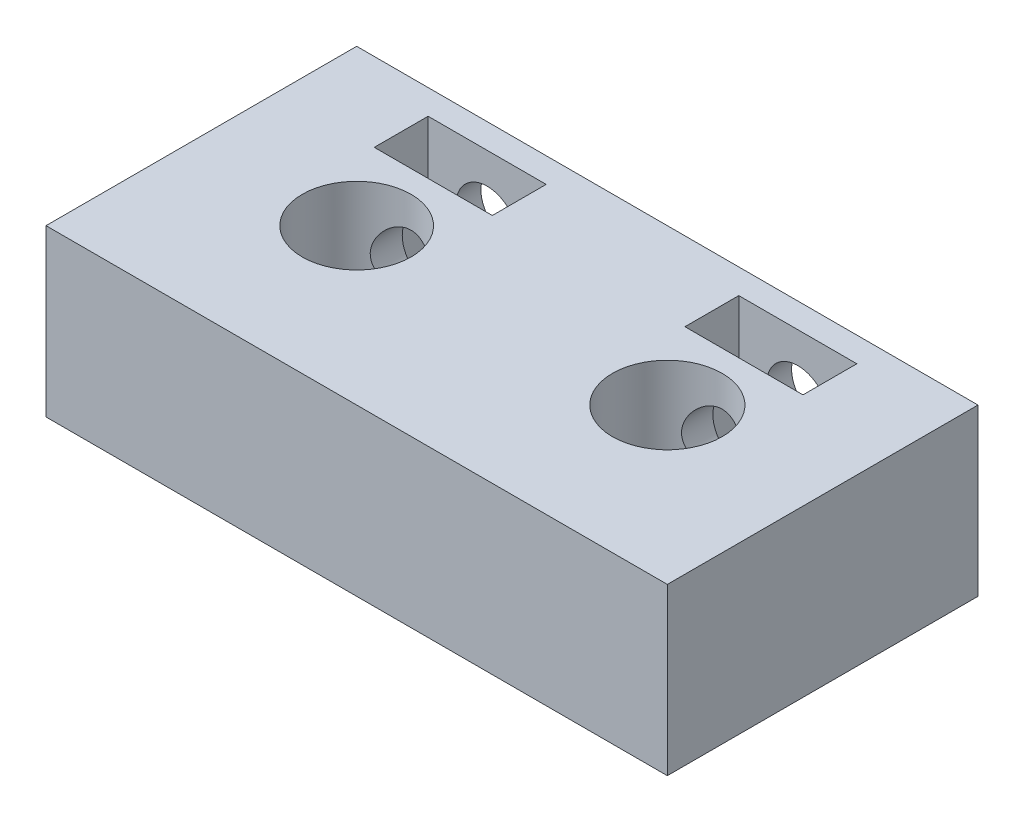
ISO-10303-21;
HEADER;
FILE_DESCRIPTION(('STEP AP214'),'2;1');
FILE_NAME('part.step','',(''),(''),'','','');
FILE_SCHEMA(('AUTOMOTIVE_DESIGN { 1 0 10303 214 1 1 1 1 }'));
ENDSEC;
DATA;
#1=APPLICATION_CONTEXT('core data for automotive mechanical design processes');
#2=APPLICATION_PROTOCOL_DEFINITION('international standard','automotive_design',2000,#1);
#3=PRODUCT_CONTEXT('',#1,'mechanical');
#4=PRODUCT('Part','Part','',(#3));
#5=PRODUCT_RELATED_PRODUCT_CATEGORY('part','',(#4));
#6=PRODUCT_DEFINITION_FORMATION('','',#4);
#7=PRODUCT_DEFINITION_CONTEXT('part definition',#1,'design');
#8=PRODUCT_DEFINITION('design','',#6,#7);
#9=PRODUCT_DEFINITION_SHAPE('','',#8);
#10=(LENGTH_UNIT() NAMED_UNIT(*) SI_UNIT(.MILLI.,.METRE.));
#11=(NAMED_UNIT(*) PLANE_ANGLE_UNIT() SI_UNIT($,.RADIAN.));
#12=(NAMED_UNIT(*) SI_UNIT($,.STERADIAN.) SOLID_ANGLE_UNIT());
#13=UNCERTAINTY_MEASURE_WITH_UNIT(LENGTH_MEASURE(1.E-05),#10,'distance_accuracy_value','');
#14=(GEOMETRIC_REPRESENTATION_CONTEXT(3) GLOBAL_UNCERTAINTY_ASSIGNED_CONTEXT((#13)) GLOBAL_UNIT_ASSIGNED_CONTEXT((#10,
#11,#12)) REPRESENTATION_CONTEXT('',''));
#15=CARTESIAN_POINT('',(0.,0.,0.));
#16=DIRECTION('',(0.,0.,1.));
#17=DIRECTION('',(1.,0.,0.));
#18=AXIS2_PLACEMENT_3D('',#15,#16,#17);
#19=CARTESIAN_POINT('',(0.,6.,0.));
#20=DIRECTION('',(0.,-1.,0.));
#21=DIRECTION('',(0.,0.,-1.));
#22=AXIS2_PLACEMENT_3D('',#19,#20,#21);
#23=PLANE('',#22);
#24=CARTESIAN_POINT('',(7.5,6.,0.));
#25=DIRECTION('',(0.,1.,0.));
#26=DIRECTION('',(0.,0.,1.));
#27=AXIS2_PLACEMENT_3D('',#24,#25,#26);
#28=CIRCLE('',#27,2.65);
#29=CARTESIAN_POINT('',(7.5,6.,2.65));
#30=VERTEX_POINT('',#29);
#31=EDGE_CURVE('E279',#30,#30,#28,.T.);
#32=ORIENTED_EDGE('',*,*,#31,.F.);
#33=EDGE_LOOP('',(#32));
#34=FACE_BOUND('',#33,.T.);
#35=DIRECTION('',(0.,0.,-1.));
#36=VECTOR('',#35,1.);
#37=CARTESIAN_POINT('',(-4.65,6.,-6.3));
#38=LINE('',#37,#36);
#39=CARTESIAN_POINT('',(-4.65,6.,-3.7));
#40=VERTEX_POINT('',#39);
#41=CARTESIAN_POINT('',(-4.65,6.,-6.3));
#42=VERTEX_POINT('',#41);
#43=EDGE_CURVE('E308',#40,#42,#38,.T.);
#44=ORIENTED_EDGE('',*,*,#43,.F.);
#45=DIRECTION('',(1.,0.,0.));
#46=VECTOR('',#45,1.);
#47=CARTESIAN_POINT('',(-10.35,6.,-3.7));
#48=LINE('',#47,#46);
#49=CARTESIAN_POINT('',(-10.35,6.,-3.7));
#50=VERTEX_POINT('',#49);
#51=EDGE_CURVE('E319',#50,#40,#48,.T.);
#52=ORIENTED_EDGE('',*,*,#51,.F.);
#53=DIRECTION('',(0.,0.,1.));
#54=VECTOR('',#53,1.);
#55=CARTESIAN_POINT('',(-10.35,6.,-6.3));
#56=LINE('',#55,#54);
#57=CARTESIAN_POINT('',(-10.35,6.,-6.3));
#58=VERTEX_POINT('',#57);
#59=EDGE_CURVE('E315',#58,#50,#56,.T.);
#60=ORIENTED_EDGE('',*,*,#59,.F.);
#61=DIRECTION('',(-1.,0.,0.));
#62=VECTOR('',#61,1.);
#63=CARTESIAN_POINT('',(-10.35,6.,-6.3));
#64=LINE('',#63,#62);
#65=EDGE_CURVE('E311',#42,#58,#64,.T.);
#66=ORIENTED_EDGE('',*,*,#65,.F.);
#67=EDGE_LOOP('',(#44,#52,#60,#66));
#68=FACE_BOUND('',#67,.T.);
#69=DIRECTION('',(0.,0.,-1.));
#70=VECTOR('',#69,1.);
#71=CARTESIAN_POINT('',(15.,6.,7.5));
#72=LINE('',#71,#70);
#73=CARTESIAN_POINT('',(15.,6.,7.5));
#74=VERTEX_POINT('',#73);
#75=CARTESIAN_POINT('',(15.,6.,-7.5));
#76=VERTEX_POINT('',#75);
#77=EDGE_CURVE('E355',#74,#76,#72,.T.);
#78=ORIENTED_EDGE('',*,*,#77,.T.);
#79=DIRECTION('',(-1.,0.,0.));
#80=VECTOR('',#79,1.);
#81=CARTESIAN_POINT('',(-15.,6.,-7.5));
#82=LINE('',#81,#80);
#83=CARTESIAN_POINT('',(-15.,6.,-7.5));
#84=VERTEX_POINT('',#83);
#85=EDGE_CURVE('E359',#76,#84,#82,.T.);
#86=ORIENTED_EDGE('',*,*,#85,.T.);
#87=DIRECTION('',(0.,0.,1.));
#88=VECTOR('',#87,1.);
#89=CARTESIAN_POINT('',(-15.,6.,7.5));
#90=LINE('',#89,#88);
#91=CARTESIAN_POINT('',(-15.,6.,7.5));
#92=VERTEX_POINT('',#91);
#93=EDGE_CURVE('E138',#84,#92,#90,.T.);
#94=ORIENTED_EDGE('',*,*,#93,.T.);
#95=DIRECTION('',(1.,0.,0.));
#96=VECTOR('',#95,1.);
#97=CARTESIAN_POINT('',(-15.,6.,7.5));
#98=LINE('',#97,#96);
#99=EDGE_CURVE('E364',#92,#74,#98,.T.);
#100=ORIENTED_EDGE('',*,*,#99,.T.);
#101=EDGE_LOOP('',(#78,#86,#94,#100));
#102=FACE_BOUND('',#101,.T.);
#103=CARTESIAN_POINT('',(-7.5,6.,0.));
#104=DIRECTION('',(0.,1.,0.));
#105=DIRECTION('',(0.,0.,1.));
#106=AXIS2_PLACEMENT_3D('',#103,#104,#105);
#107=CIRCLE('',#106,2.625);
#108=CARTESIAN_POINT('',(-7.5,6.,2.625));
#109=VERTEX_POINT('',#108);
#110=EDGE_CURVE('E351',#109,#109,#107,.T.);
#111=ORIENTED_EDGE('',*,*,#110,.F.);
#112=EDGE_LOOP('',(#111));
#113=FACE_BOUND('',#112,.T.);
#114=DIRECTION('',(0.,0.,-1.));
#115=VECTOR('',#114,1.);
#116=CARTESIAN_POINT('',(10.35,6.,-6.3));
#117=LINE('',#116,#115);
#118=CARTESIAN_POINT('',(10.35,6.,-3.7));
#119=VERTEX_POINT('',#118);
#120=CARTESIAN_POINT('',(10.35,6.,-6.3));
#121=VERTEX_POINT('',#120);
#122=EDGE_CURVE('E277',#119,#121,#117,.T.);
#123=ORIENTED_EDGE('',*,*,#122,.F.);
#124=DIRECTION('',(1.,0.,0.));
#125=VECTOR('',#124,1.);
#126=CARTESIAN_POINT('',(10.35,6.,-3.7));
#127=LINE('',#126,#125);
#128=CARTESIAN_POINT('',(4.65,6.,-3.7));
#129=VERTEX_POINT('',#128);
#130=EDGE_CURVE('E290',#129,#119,#127,.T.);
#131=ORIENTED_EDGE('',*,*,#130,.F.);
#132=DIRECTION('',(0.,0.,1.));
#133=VECTOR('',#132,1.);
#134=CARTESIAN_POINT('',(4.65,6.,-6.3));
#135=LINE('',#134,#133);
#136=CARTESIAN_POINT('',(4.65,6.,-6.3));
#137=VERTEX_POINT('',#136);
#138=EDGE_CURVE('E376',#137,#129,#135,.T.);
#139=ORIENTED_EDGE('',*,*,#138,.F.);
#140=DIRECTION('',(-1.,0.,0.));
#141=VECTOR('',#140,1.);
#142=CARTESIAN_POINT('',(10.35,6.,-6.3));
#143=LINE('',#142,#141);
#144=EDGE_CURVE('E380',#121,#137,#143,.T.);
#145=ORIENTED_EDGE('',*,*,#144,.F.);
#146=EDGE_LOOP('',(#123,#131,#139,#145));
#147=FACE_BOUND('',#146,.T.);
#148=ADVANCED_FACE('F39',(#34,#68,#102,#113,#147),#23,.F.);
#149=CARTESIAN_POINT('',(15.,6.,7.5));
#150=DIRECTION('',(-1.,0.,0.));
#151=DIRECTION('',(0.,0.,1.));
#152=AXIS2_PLACEMENT_3D('',#149,#150,#151);
#153=PLANE('',#152);
#154=DIRECTION('',(0.,-1.,0.));
#155=VECTOR('',#154,1.);
#156=CARTESIAN_POINT('',(15.,6.,7.5));
#157=LINE('',#156,#155);
#158=CARTESIAN_POINT('',(15.,-2.,7.5));
#159=VERTEX_POINT('',#158);
#160=EDGE_CURVE('E367',#74,#159,#157,.T.);
#161=ORIENTED_EDGE('',*,*,#160,.T.);
#162=DIRECTION('',(0.,0.,1.));
#163=VECTOR('',#162,1.);
#164=CARTESIAN_POINT('',(15.,-2.,7.5));
#165=LINE('',#164,#163);
#166=CARTESIAN_POINT('',(15.,-2.,-7.5));
#167=VERTEX_POINT('',#166);
#168=EDGE_CURVE('E151',#167,#159,#165,.T.);
#169=ORIENTED_EDGE('',*,*,#168,.F.);
#170=DIRECTION('',(0.,-1.,0.));
#171=VECTOR('',#170,1.);
#172=CARTESIAN_POINT('',(15.,6.,-7.5));
#173=LINE('',#172,#171);
#174=EDGE_CURVE('E11',#76,#167,#173,.T.);
#175=ORIENTED_EDGE('',*,*,#174,.F.);
#176=ORIENTED_EDGE('',*,*,#77,.F.);
#177=EDGE_LOOP('',(#161,#169,#175,#176));
#178=FACE_BOUND('',#177,.T.);
#179=ADVANCED_FACE('F41',(#178),#153,.F.);
#180=CARTESIAN_POINT('',(-15.,6.,-7.5));
#181=DIRECTION('',(0.,0.,1.));
#182=DIRECTION('',(1.,0.,0.));
#183=AXIS2_PLACEMENT_3D('',#180,#181,#182);
#184=PLANE('',#183);
#185=CARTESIAN_POINT('',(-7.5,3.,-7.5));
#186=DIRECTION('',(0.,0.,-1.));
#187=DIRECTION('',(-1.,0.,0.));
#188=AXIS2_PLACEMENT_3D('',#185,#186,#187);
#189=CIRCLE('',#188,1.5);
#190=CARTESIAN_POINT('',(-9.,3.,-7.5));
#191=VERTEX_POINT('',#190);
#192=EDGE_CURVE('E172',#191,#191,#189,.T.);
#193=ORIENTED_EDGE('',*,*,#192,.F.);
#194=EDGE_LOOP('',(#193));
#195=FACE_BOUND('',#194,.T.);
#196=CARTESIAN_POINT('',(7.5,3.,-7.5));
#197=DIRECTION('',(0.,0.,-1.));
#198=DIRECTION('',(1.,0.,0.));
#199=AXIS2_PLACEMENT_3D('',#196,#197,#198);
#200=CIRCLE('',#199,1.5);
#201=CARTESIAN_POINT('',(9.,3.,-7.5));
#202=VERTEX_POINT('',#201);
#203=EDGE_CURVE('E171',#202,#202,#200,.T.);
#204=ORIENTED_EDGE('',*,*,#203,.F.);
#205=EDGE_LOOP('',(#204));
#206=FACE_BOUND('',#205,.T.);
#207=ORIENTED_EDGE('',*,*,#174,.T.);
#208=DIRECTION('',(1.,0.,0.));
#209=VECTOR('',#208,1.);
#210=CARTESIAN_POINT('',(-15.,-2.,-7.5));
#211=LINE('',#210,#209);
#212=CARTESIAN_POINT('',(-15.,-2.,-7.5));
#213=VERTEX_POINT('',#212);
#214=EDGE_CURVE('E144',#213,#167,#211,.T.);
#215=ORIENTED_EDGE('',*,*,#214,.F.);
#216=DIRECTION('',(0.,-1.,0.));
#217=VECTOR('',#216,1.);
#218=CARTESIAN_POINT('',(-15.,6.,-7.5));
#219=LINE('',#218,#217);
#220=EDGE_CURVE('E49',#84,#213,#219,.T.);
#221=ORIENTED_EDGE('',*,*,#220,.F.);
#222=ORIENTED_EDGE('',*,*,#85,.F.);
#223=EDGE_LOOP('',(#207,#215,#221,#222));
#224=FACE_BOUND('',#223,.T.);
#225=ADVANCED_FACE('F145',(#195,#206,#224),#184,.F.);
#226=CARTESIAN_POINT('',(-15.,6.,7.5));
#227=DIRECTION('',(1.,0.,0.));
#228=DIRECTION('',(0.,0.,-1.));
#229=AXIS2_PLACEMENT_3D('',#226,#227,#228);
#230=PLANE('',#229);
#231=ORIENTED_EDGE('',*,*,#220,.T.);
#232=DIRECTION('',(0.,0.,-1.));
#233=VECTOR('',#232,1.);
#234=CARTESIAN_POINT('',(-15.,-2.,7.5));
#235=LINE('',#234,#233);
#236=CARTESIAN_POINT('',(-15.,-2.,7.5));
#237=VERTEX_POINT('',#236);
#238=EDGE_CURVE('E137',#237,#213,#235,.T.);
#239=ORIENTED_EDGE('',*,*,#238,.F.);
#240=DIRECTION('',(0.,-1.,0.));
#241=VECTOR('',#240,1.);
#242=CARTESIAN_POINT('',(-15.,6.,7.5));
#243=LINE('',#242,#241);
#244=EDGE_CURVE('E141',#92,#237,#243,.T.);
#245=ORIENTED_EDGE('',*,*,#244,.F.);
#246=ORIENTED_EDGE('',*,*,#93,.F.);
#247=EDGE_LOOP('',(#231,#239,#245,#246));
#248=FACE_BOUND('',#247,.T.);
#249=ADVANCED_FACE('F134',(#248),#230,.F.);
#250=CARTESIAN_POINT('',(-15.,6.,7.5));
#251=DIRECTION('',(0.,0.,-1.));
#252=DIRECTION('',(-1.,0.,0.));
#253=AXIS2_PLACEMENT_3D('',#250,#251,#252);
#254=PLANE('',#253);
#255=ORIENTED_EDGE('',*,*,#244,.T.);
#256=DIRECTION('',(-1.,0.,0.));
#257=VECTOR('',#256,1.);
#258=CARTESIAN_POINT('',(-15.,-2.,7.5));
#259=LINE('',#258,#257);
#260=EDGE_CURVE('E157',#159,#237,#259,.T.);
#261=ORIENTED_EDGE('',*,*,#260,.F.);
#262=ORIENTED_EDGE('',*,*,#160,.F.);
#263=ORIENTED_EDGE('',*,*,#99,.F.);
#264=EDGE_LOOP('',(#255,#261,#262,#263));
#265=FACE_BOUND('',#264,.T.);
#266=ADVANCED_FACE('F241',(#265),#254,.F.);
#267=CARTESIAN_POINT('',(-7.5,6.,0.));
#268=DIRECTION('',(0.,-1.,0.));
#269=DIRECTION('',(0.,0.,-1.));
#270=AXIS2_PLACEMENT_3D('',#267,#268,#269);
#271=CYLINDRICAL_SURFACE('',#270,2.625);
#272=CARTESIAN_POINT('',(-7.5,4.5,-2.625));
#273=CARTESIAN_POINT('',(-7.57735322528532,4.4999907358705,-2.62499197908007));
#274=CARTESIAN_POINT('',(-7.65481705069273,4.49397560572373,-2.62154288781886));
#275=CARTESIAN_POINT('',(-7.80745032531984,4.47019527509373,-2.60806599239066));
#276=CARTESIAN_POINT('',(-7.88261333647088,4.45239978664558,-2.59802123092419));
#277=CARTESIAN_POINT('',(-8.02810340852896,4.40602550543136,-2.57238447222967));
#278=CARTESIAN_POINT('',(-8.09845161617132,4.37749799453813,-2.55681887566739));
#279=CARTESIAN_POINT('',(-8.23317427495931,4.31076770707209,-2.52149506519295));
#280=CARTESIAN_POINT('',(-8.29755038378462,4.27256762636686,-2.50173801973901));
#281=CARTESIAN_POINT('',(-8.42376258034736,4.184485620362,-2.45806068827724));
#282=CARTESIAN_POINT('',(-8.48507919666194,4.13395913668844,-2.43394275136285));
#283=CARTESIAN_POINT('',(-8.5988734087538,4.02408200209884,-2.38473357749033));
#284=CARTESIAN_POINT('',(-8.65134048358553,3.96472100366597,-2.3596412250565));
#285=CARTESIAN_POINT('',(-8.75170815977458,3.83122768293492,-2.30810878828587));
#286=CARTESIAN_POINT('',(-8.79849283151363,3.75619115341052,-2.28181859104983));
#287=CARTESIAN_POINT('',(-8.87858438747937,3.59778729662904,-2.23434765058077));
#288=CARTESIAN_POINT('',(-8.91191167534148,3.51443282190888,-2.21315919210509));
#289=CARTESIAN_POINT('',(-8.9576950863385,3.36064112660669,-2.18319179076878));
#290=CARTESIAN_POINT('',(-8.97313754948654,3.29142636433421,-2.17270444199319));
#291=CARTESIAN_POINT('',(-8.99408007147868,3.15086269826455,-2.15836004310351));
#292=CARTESIAN_POINT('',(-8.99959078808527,3.07951616578152,-2.15449588585746));
#293=CARTESIAN_POINT('',(-9.00036568853121,2.93664398600917,-2.15395640456745));
#294=CARTESIAN_POINT('',(-8.99561587897144,2.86511822715762,-2.15729089810517));
#295=CARTESIAN_POINT('',(-8.97612372283051,2.72407312111244,-2.17067210203505));
#296=CARTESIAN_POINT('',(-8.96137450097707,2.65455518874597,-2.1807234306375));
#297=CARTESIAN_POINT('',(-8.92268814579187,2.51950130225976,-2.20615276015128));
#298=CARTESIAN_POINT('',(-8.89878673837558,2.45395099837556,-2.22151002663075));
#299=CARTESIAN_POINT('',(-8.84262746652968,2.32758761049189,-2.25589414987234));
#300=CARTESIAN_POINT('',(-8.8103664048732,2.26677635058366,-2.27492240992687));
#301=CARTESIAN_POINT('',(-8.73242826286337,2.14127032847266,-2.31819610284085));
#302=CARTESIAN_POINT('',(-8.68542972731186,2.07751489370389,-2.34278893950805));
#303=CARTESIAN_POINT('',(-8.5820649294193,1.95818676037395,-2.39228951759385));
#304=CARTESIAN_POINT('',(-8.52569068189581,1.90262111370605,-2.41719751057571));
#305=CARTESIAN_POINT('',(-8.39748053702884,1.79488184893998,-2.46787834201703));
#306=CARTESIAN_POINT('',(-8.32461493901303,1.74381528666153,-2.49342659800526));
#307=CARTESIAN_POINT('',(-8.16976161799173,1.65486990640865,-2.53939951917442));
#308=CARTESIAN_POINT('',(-8.08777968710785,1.61698277726145,-2.55982741106353));
#309=CARTESIAN_POINT('',(-7.92284533363438,1.55836205683056,-2.59198524072872));
#310=CARTESIAN_POINT('',(-7.84035164509024,1.53662384203861,-2.60421877523866));
#311=CARTESIAN_POINT('',(-7.67211980216773,1.50747138084092,-2.62070926874757));
#312=CARTESIAN_POINT('',(-7.58638493265412,1.50004300857495,-2.62497409387669));
#313=CARTESIAN_POINT('',(-7.42535740551492,1.49996249164961,-2.62502260187075));
#314=CARTESIAN_POINT('',(-7.35005929575787,1.5056276503618,-2.62177208877354));
#315=CARTESIAN_POINT('',(-7.20168378077169,1.52805043004635,-2.60905630937292));
#316=CARTESIAN_POINT('',(-7.12860641363529,1.54480824118043,-2.59959093652798));
#317=CARTESIAN_POINT('',(-6.98732189645747,1.58841347885031,-2.57543733665809));
#318=CARTESIAN_POINT('',(-6.9190724902409,1.61515568245572,-2.56080366106184));
#319=CARTESIAN_POINT('',(-6.78798348287649,1.67776180203534,-2.52749622658412));
#320=CARTESIAN_POINT('',(-6.72514518913115,1.71362791424592,-2.50882149513298));
#321=CARTESIAN_POINT('',(-6.59961752161702,1.79767038064341,-2.46673100993714));
#322=CARTESIAN_POINT('',(-6.53762447185795,1.84673950362204,-2.44302409965138));
#323=CARTESIAN_POINT('',(-6.422270848516,1.95372124584208,-2.39437943126628));
#324=CARTESIAN_POINT('',(-6.36892029727801,2.01164398315565,-2.36944028730018));
#325=CARTESIAN_POINT('',(-6.26630454002119,2.14230189285665,-2.31781630171777));
#326=CARTESIAN_POINT('',(-6.21815859963548,2.21596859894444,-2.2912469796316));
#327=CARTESIAN_POINT('',(-6.13504967777411,2.37176597356124,-2.24273510566452));
#328=CARTESIAN_POINT('',(-6.10006917646758,2.453885207172,-2.22078642216869));
#329=CARTESIAN_POINT('',(-6.05083418078485,2.60642644800739,-2.18888425072269));
#330=CARTESIAN_POINT('',(-6.03375034916584,2.67560736827675,-2.17737079166449));
#331=CARTESIAN_POINT('',(-6.00956747465218,2.81642556925454,-2.16089274248261));
#332=CARTESIAN_POINT('',(-6.00245707046929,2.88805995958608,-2.15592070106607));
#333=CARTESIAN_POINT('',(-5.99861106238027,3.03189207741097,-2.1532448402624));
#334=CARTESIAN_POINT('',(-6.0018963461276,3.10409064794954,-2.15555565399692));
#335=CARTESIAN_POINT('',(-6.01868712174108,3.24673286297903,-2.16712605076725));
#336=CARTESIAN_POINT('',(-6.03219907768348,3.31717536839532,-2.17639002872912));
#337=CARTESIAN_POINT('',(-6.06842216896712,3.45328172492279,-2.20037855816345));
#338=CARTESIAN_POINT('',(-6.09097009296889,3.5190071692334,-2.21500585621478));
#339=CARTESIAN_POINT('',(-6.14443357617448,3.64589932126098,-2.24812164919644));
#340=CARTESIAN_POINT('',(-6.17535222101366,3.70706433727664,-2.2666115674));
#341=CARTESIAN_POINT('',(-6.25017624430834,3.83313250206093,-2.30882642507801));
#342=CARTESIAN_POINT('',(-6.29534826475152,3.89716094475525,-2.33291905735061));
#343=CARTESIAN_POINT('',(-6.39496045101593,4.01734321587209,-2.38172050283922));
#344=CARTESIAN_POINT('',(-6.44940865735371,4.07349013499187,-2.4064298346106));
#345=CARTESIAN_POINT('',(-6.57408912383045,4.1833955820752,-2.45731360872917));
#346=CARTESIAN_POINT('',(-6.64544247258216,4.23598694357159,-2.48328759383248));
#347=CARTESIAN_POINT('',(-6.79748861402696,4.32829393464198,-2.53049704697791));
#348=CARTESIAN_POINT('',(-6.87817614315313,4.36801677323925,-2.55173516599472));
#349=CARTESIAN_POINT('',(-7.03171393073198,4.42696334112213,-2.58386490684566));
#350=CARTESIAN_POINT('',(-7.10340736092394,4.44857591755958,-2.59592467603996));
#351=CARTESIAN_POINT('',(-7.24981789623475,4.48087498779357,-2.61408325557267));
#352=CARTESIAN_POINT('',(-7.32452561092092,4.49159304460211,-2.62019928352243));
#353=CARTESIAN_POINT('',(-7.43303179900036,4.49888195392028,-2.62436176326155));
#354=CARTESIAN_POINT('',(-7.46650553102359,4.50000401143064,-2.6250034731125));
#355=CARTESIAN_POINT('',(-7.5,4.5,-2.625));
#356=B_SPLINE_CURVE_WITH_KNOTS('',3,(#272,#273,#274,#275,#276,#277,#278,#279,#280,#281,#282,
#283,#284,#285,#286,#287,#288,#289,#290,#291,#292,#293,#294,#295,#296,#297,#298,#299,#300,#301,
#302,#303,#304,#305,#306,#307,#308,#309,#310,#311,#312,#313,#314,#315,#316,#317,#318,#319,#320,
#321,#322,#323,#324,#325,#326,#327,#328,#329,#330,#331,#332,#333,#334,#335,#336,#337,#338,#339,
#340,#341,#342,#343,#344,#345,#346,#347,#348,#349,#350,#351,#352,#353,#354,#355),.UNSPECIFIED.,
.T.,.F.,(4,2,2,2,2,2,2,2,2,2,2,2,2,2,2,2,2,2,2,2,2,2,2,2,2,2,2,2,2,2,2,2,2,2,2,2,2,2,2,2,2,4),
(0.,0.231951452445441,0.46450159343127,0.695954347868774,0.927342664365661,1.17544698100632,
1.42384421329806,1.69923630329632,1.97420927092745,2.18834367774589,2.40224815968795,
2.61644455067015,2.83078836572093,3.04430387303164,3.25790116215674,3.50572771415299,
3.75376642824823,4.03005426308241,4.30616754894232,4.56319635835322,4.81997131330642,
5.04560661105223,5.27124577697175,5.49457119515182,5.7179504214422,5.96458097363841,
6.21149551666469,6.48594848079577,6.76003491592765,6.97565947082463,7.19103819570753,
7.40684994731048,7.62279822327169,7.83501011281155,8.04730033517293,8.2922802852843,
8.53747367241544,8.81318645279524,9.0887445090587,9.31531451337698,9.5412262241961,
9.64166276965766),.UNSPECIFIED.);
#357=CARTESIAN_POINT('',(-7.5,4.5,-2.625));
#358=VERTEX_POINT('',#357);
#359=EDGE_CURVE('E285',#358,#358,#356,.T.);
#360=ORIENTED_EDGE('',*,*,#359,.F.);
#361=EDGE_LOOP('',(#360));
#362=FACE_BOUND('',#361,.T.);
#363=ORIENTED_EDGE('',*,*,#110,.T.);
#364=EDGE_LOOP('',(#363));
#365=FACE_BOUND('',#364,.T.);
#366=CARTESIAN_POINT('',(-7.5,-2.,0.));
#367=DIRECTION('',(0.,-1.,0.));
#368=DIRECTION('',(0.,0.,-1.));
#369=AXIS2_PLACEMENT_3D('',#366,#367,#368);
#370=CIRCLE('',#369,2.625);
#371=CARTESIAN_POINT('',(-7.5,-2.,-2.625));
#372=VERTEX_POINT('',#371);
#373=EDGE_CURVE('E159',#372,#372,#370,.T.);
#374=ORIENTED_EDGE('',*,*,#373,.T.);
#375=EDGE_LOOP('',(#374));
#376=FACE_BOUND('',#375,.T.);
#377=ADVANCED_FACE('F238',(#362,#365,#376),#271,.F.);
#378=CARTESIAN_POINT('',(-4.65,6.,-6.3));
#379=DIRECTION('',(-1.,0.,0.));
#380=DIRECTION('',(0.,0.,1.));
#381=AXIS2_PLACEMENT_3D('',#378,#379,#380);
#382=PLANE('',#381);
#383=DIRECTION('',(0.,0.,-1.));
#384=VECTOR('',#383,1.);
#385=CARTESIAN_POINT('',(-4.65,0.,-6.3));
#386=LINE('',#385,#384);
#387=CARTESIAN_POINT('',(-4.65,0.,-3.7));
#388=VERTEX_POINT('',#387);
#389=CARTESIAN_POINT('',(-4.65,0.,-6.3));
#390=VERTEX_POINT('',#389);
#391=EDGE_CURVE('E307',#388,#390,#386,.T.);
#392=ORIENTED_EDGE('',*,*,#391,.F.);
#393=DIRECTION('',(0.,-1.,0.));
#394=VECTOR('',#393,1.);
#395=CARTESIAN_POINT('',(-4.65,6.,-3.7));
#396=LINE('',#395,#394);
#397=EDGE_CURVE('E322',#40,#388,#396,.T.);
#398=ORIENTED_EDGE('',*,*,#397,.F.);
#399=ORIENTED_EDGE('',*,*,#43,.T.);
#400=DIRECTION('',(0.,-1.,0.));
#401=VECTOR('',#400,1.);
#402=CARTESIAN_POINT('',(-4.65,6.,-6.3));
#403=LINE('',#402,#401);
#404=EDGE_CURVE('E347',#42,#390,#403,.T.);
#405=ORIENTED_EDGE('',*,*,#404,.T.);
#406=EDGE_LOOP('',(#392,#398,#399,#405));
#407=FACE_BOUND('',#406,.T.);
#408=ADVANCED_FACE('F401',(#407),#382,.T.);
#409=CARTESIAN_POINT('',(-10.35,6.,-6.3));
#410=DIRECTION('',(0.,0.,1.));
#411=DIRECTION('',(1.,0.,0.));
#412=AXIS2_PLACEMENT_3D('',#409,#410,#411);
#413=PLANE('',#412);
#414=CARTESIAN_POINT('',(-7.5,3.,-6.3));
#415=DIRECTION('',(0.,0.,1.));
#416=DIRECTION('',(1.,0.,0.));
#417=AXIS2_PLACEMENT_3D('',#414,#415,#416);
#418=CIRCLE('',#417,1.5);
#419=CARTESIAN_POINT('',(-6.,3.,-6.3));
#420=VERTEX_POINT('',#419);
#421=EDGE_CURVE('E193',#420,#420,#418,.T.);
#422=ORIENTED_EDGE('',*,*,#421,.F.);
#423=EDGE_LOOP('',(#422));
#424=FACE_BOUND('',#423,.T.);
#425=DIRECTION('',(-1.,0.,0.));
#426=VECTOR('',#425,1.);
#427=CARTESIAN_POINT('',(-10.35,0.,-6.3));
#428=LINE('',#427,#426);
#429=CARTESIAN_POINT('',(-10.35,0.,-6.3));
#430=VERTEX_POINT('',#429);
#431=EDGE_CURVE('E326',#390,#430,#428,.T.);
#432=ORIENTED_EDGE('',*,*,#431,.F.);
#433=ORIENTED_EDGE('',*,*,#404,.F.);
#434=ORIENTED_EDGE('',*,*,#65,.T.);
#435=DIRECTION('',(0.,-1.,0.));
#436=VECTOR('',#435,1.);
#437=CARTESIAN_POINT('',(-10.35,6.,-6.3));
#438=LINE('',#437,#436);
#439=EDGE_CURVE('E344',#58,#430,#438,.T.);
#440=ORIENTED_EDGE('',*,*,#439,.T.);
#441=EDGE_LOOP('',(#432,#433,#434,#440));
#442=FACE_BOUND('',#441,.T.);
#443=ADVANCED_FACE('F397',(#424,#442),#413,.T.);
#444=CARTESIAN_POINT('',(-10.35,6.,-6.3));
#445=DIRECTION('',(1.,0.,0.));
#446=DIRECTION('',(0.,0.,-1.));
#447=AXIS2_PLACEMENT_3D('',#444,#445,#446);
#448=PLANE('',#447);
#449=DIRECTION('',(0.,0.,1.));
#450=VECTOR('',#449,1.);
#451=CARTESIAN_POINT('',(-10.35,0.,-6.3));
#452=LINE('',#451,#450);
#453=CARTESIAN_POINT('',(-10.35,0.,-3.7));
#454=VERTEX_POINT('',#453);
#455=EDGE_CURVE('E330',#430,#454,#452,.T.);
#456=ORIENTED_EDGE('',*,*,#455,.F.);
#457=ORIENTED_EDGE('',*,*,#439,.F.);
#458=ORIENTED_EDGE('',*,*,#59,.T.);
#459=DIRECTION('',(0.,-1.,0.));
#460=VECTOR('',#459,1.);
#461=CARTESIAN_POINT('',(-10.35,6.,-3.7));
#462=LINE('',#461,#460);
#463=EDGE_CURVE('E340',#50,#454,#462,.T.);
#464=ORIENTED_EDGE('',*,*,#463,.T.);
#465=EDGE_LOOP('',(#456,#457,#458,#464));
#466=FACE_BOUND('',#465,.T.);
#467=ADVANCED_FACE('F400',(#466),#448,.T.);
#468=CARTESIAN_POINT('',(-10.35,6.,-3.7));
#469=DIRECTION('',(0.,0.,-1.));
#470=DIRECTION('',(-1.,0.,0.));
#471=AXIS2_PLACEMENT_3D('',#468,#469,#470);
#472=PLANE('',#471);
#473=CARTESIAN_POINT('',(-7.5,3.,-3.7));
#474=DIRECTION('',(0.,0.,-1.));
#475=DIRECTION('',(-1.,0.,0.));
#476=AXIS2_PLACEMENT_3D('',#473,#474,#475);
#477=CIRCLE('',#476,1.5);
#478=CARTESIAN_POINT('',(-9.,3.,-3.7));
#479=VERTEX_POINT('',#478);
#480=EDGE_CURVE('E43',#479,#479,#477,.T.);
#481=ORIENTED_EDGE('',*,*,#480,.F.);
#482=EDGE_LOOP('',(#481));
#483=FACE_BOUND('',#482,.T.);
#484=DIRECTION('',(1.,0.,0.));
#485=VECTOR('',#484,1.);
#486=CARTESIAN_POINT('',(-10.35,0.,-3.7));
#487=LINE('',#486,#485);
#488=EDGE_CURVE('E312',#454,#388,#487,.T.);
#489=ORIENTED_EDGE('',*,*,#488,.F.);
#490=ORIENTED_EDGE('',*,*,#463,.F.);
#491=ORIENTED_EDGE('',*,*,#51,.T.);
#492=ORIENTED_EDGE('',*,*,#397,.T.);
#493=EDGE_LOOP('',(#489,#490,#491,#492));
#494=FACE_BOUND('',#493,.T.);
#495=ADVANCED_FACE('F225',(#483,#494),#472,.T.);
#496=CARTESIAN_POINT('',(7.5,6.,0.));
#497=DIRECTION('',(0.,-1.,0.));
#498=DIRECTION('',(0.,0.,-1.));
#499=AXIS2_PLACEMENT_3D('',#496,#497,#498);
#500=CYLINDRICAL_SURFACE('',#499,2.65);
#501=CARTESIAN_POINT('',(7.5,4.5,-2.65));
#502=CARTESIAN_POINT('',(7.42235486485452,4.50000445616459,-2.65000392335561));
#503=CARTESIAN_POINT('',(7.34473475687052,4.49394609079311,-2.6465595998598));
#504=CARTESIAN_POINT('',(7.1919189913569,4.47005631321782,-2.63314780218255));
#505=CARTESIAN_POINT('',(7.11672345383309,4.45222431920528,-2.62318000563567));
#506=CARTESIAN_POINT('',(6.97110342576895,4.40573653220259,-2.59773372721452));
#507=CARTESIAN_POINT('',(6.90066240513279,4.37712078882913,-2.58227564769634));
#508=CARTESIAN_POINT('',(6.76572191091049,4.31015835750319,-2.54719500836197));
#509=CARTESIAN_POINT('',(6.70122392363372,4.27180924426055,-2.52757141081212));
#510=CARTESIAN_POINT('',(6.57485426556731,4.18341416344298,-2.4842261400934));
#511=CARTESIAN_POINT('',(6.51349628491121,4.13272993216487,-2.46031219465887));
#512=CARTESIAN_POINT('',(6.39965679887998,4.02251250505507,-2.41155294861164));
#513=CARTESIAN_POINT('',(6.347184805745,3.96296995304427,-2.38670668428515));
#514=CARTESIAN_POINT('',(6.24697410419521,3.82923538121635,-2.33578842282799));
#515=CARTESIAN_POINT('',(6.20032965636103,3.75415916233436,-2.30986642473796));
#516=CARTESIAN_POINT('',(6.12052626731471,3.59572494193617,-2.26311804671517));
#517=CARTESIAN_POINT('',(6.08734734685679,3.51237944019529,-2.24228413584786));
#518=CARTESIAN_POINT('',(6.04172474966582,3.3583421400138,-2.21280459756456));
#519=CARTESIAN_POINT('',(6.0263409198358,3.28884020502709,-2.202493687969));
#520=CARTESIAN_POINT('',(6.00559466467575,3.14773012085773,-2.1884735870522));
#521=CARTESIAN_POINT('',(6.00022181165195,3.07612424228474,-2.18475752655671));
#522=CARTESIAN_POINT('',(5.99979139416403,2.9327777633035,-2.18446199582159));
#523=CARTESIAN_POINT('',(6.00474692093062,2.86103710721036,-2.18789158269465));
#524=CARTESIAN_POINT('',(6.02470877529796,2.7195984351566,-2.20139839758785));
#525=CARTESIAN_POINT('',(6.03972187986895,2.64990182958657,-2.21148010785493));
#526=CARTESIAN_POINT('',(6.07901903557027,2.51442712861243,-2.23692928486277));
#527=CARTESIAN_POINT('',(6.10328070490187,2.4486400129564,-2.25228398199633));
#528=CARTESIAN_POINT('',(6.16023742135705,2.32186132528258,-2.28662193870185));
#529=CARTESIAN_POINT('',(6.19293572271439,2.26087161562383,-2.30560659771351));
#530=CARTESIAN_POINT('',(6.27179101294555,2.13522482411746,-2.34868509447826));
#531=CARTESIAN_POINT('',(6.3192564484562,2.07150219952729,-2.37311273769192));
#532=CARTESIAN_POINT('',(6.42358700927361,1.95232868996513,-2.42222294984682));
#533=CARTESIAN_POINT('',(6.48045994645553,1.89688475293434,-2.44690571453282));
#534=CARTESIAN_POINT('',(6.60946663566025,1.78974236420858,-2.4969459851787));
#535=CARTESIAN_POINT('',(6.68258956777221,1.73911906547338,-2.52208135261908));
#536=CARTESIAN_POINT('',(6.83785555691275,1.6511074979702,-2.56721303771464));
#537=CARTESIAN_POINT('',(6.91999278328251,1.61371073930599,-2.58721264965889));
#538=CARTESIAN_POINT('',(7.08503762112279,1.55608150230661,-2.61856037299321));
#539=CARTESIAN_POINT('',(7.16749079678859,1.53483268048695,-2.63041515335286));
#540=CARTESIAN_POINT('',(7.335519597738,1.5066201481767,-2.64623163960658));
#541=CARTESIAN_POINT('',(7.42109217781818,1.49964286662342,-2.65020084393257));
#542=CARTESIAN_POINT('',(7.58195842468542,1.50034205932854,-2.64980753363073));
#543=CARTESIAN_POINT('',(7.65726787011689,1.50637920755649,-2.6463770645567));
#544=CARTESIAN_POINT('',(7.80560403235512,1.52954427487749,-2.63337194483695));
#545=CARTESIAN_POINT('',(7.87863069728929,1.54667244580484,-2.62379715467745));
#546=CARTESIAN_POINT('',(8.01993414878415,1.59105896554533,-2.59947590146879));
#547=CARTESIAN_POINT('',(8.08824398063709,1.61823598882585,-2.58477100896598));
#548=CARTESIAN_POINT('',(8.21939071472643,1.68174706566655,-2.55138431451472));
#549=CARTESIAN_POINT('',(8.28222624457552,1.71808340659568,-2.53270151934047));
#550=CARTESIAN_POINT('',(8.4076632300647,1.80314072461456,-2.49067543229227));
#551=CARTESIAN_POINT('',(8.46956282158055,1.85275592347742,-2.46704964519187));
#552=CARTESIAN_POINT('',(8.58463785324289,1.96086359599015,-2.41867032353198));
#553=CARTESIAN_POINT('',(8.63780328118757,2.01936611163477,-2.3939155357132));
#554=CARTESIAN_POINT('',(8.73973034338604,2.15104191389155,-2.34289426396824));
#555=CARTESIAN_POINT('',(8.78739829519277,2.22511700700882,-2.31675276230857));
#556=CARTESIAN_POINT('',(8.86946305692568,2.38165371566672,-2.26921362691913));
#557=CARTESIAN_POINT('',(8.90387795547624,2.46410370484426,-2.24780954435424));
#558=CARTESIAN_POINT('',(8.95206499790085,2.6172281786489,-2.2169003214795));
#559=CARTESIAN_POINT('',(8.96866589800445,2.68669636386508,-2.20583494736462));
#560=CARTESIAN_POINT('',(8.99181698218517,2.82797782613719,-2.1902475245301));
#561=CARTESIAN_POINT('',(8.99837812836199,2.89978845789046,-2.18571833945387));
#562=CARTESIAN_POINT('',(9.00109196049382,3.04382712426754,-2.18385591779794));
#563=CARTESIAN_POINT('',(8.99722656450553,3.11605566697584,-2.18653518225238));
#564=CARTESIAN_POINT('',(8.979280000376,3.25865579163495,-2.19871380288595));
#565=CARTESIAN_POINT('',(8.96519231790622,3.32902615978069,-2.20821750801761));
#566=CARTESIAN_POINT('',(8.92774604072315,3.46527117744463,-2.23260537929607));
#567=CARTESIAN_POINT('',(8.90450284087821,3.53119025653175,-2.24742237666864));
#568=CARTESIAN_POINT('',(8.84957613941173,3.65836805422645,-2.2808277238179));
#569=CARTESIAN_POINT('',(8.81788946015411,3.71962500709862,-2.29941749281791));
#570=CARTESIAN_POINT('',(8.74136798471474,3.84572204728124,-2.34172877890297));
#571=CARTESIAN_POINT('',(8.69526281804395,3.90967435707476,-2.36580021059562));
#572=CARTESIAN_POINT('',(8.5937243105064,4.02953629045692,-2.41442341765651));
#573=CARTESIAN_POINT('',(8.53828333663758,4.08543926292022,-2.43897557143085));
#574=CARTESIAN_POINT('',(8.41187843157657,4.19424341439003,-2.48920098481474));
#575=CARTESIAN_POINT('',(8.33985645231804,4.24602308249203,-2.51466786795748));
#576=CARTESIAN_POINT('',(8.18662947650978,4.33658039426847,-2.5607474568879));
#577=CARTESIAN_POINT('',(8.10542822367323,4.37536331318889,-2.58136213112329));
#578=CARTESIAN_POINT('',(7.93848685773434,4.43715314053798,-2.61481418170605));
#579=CARTESIAN_POINT('',(7.85295064504188,4.46059073354224,-2.62786258293699));
#580=CARTESIAN_POINT('',(7.67826268988373,4.4920034539497,-2.64544875374138));
#581=CARTESIAN_POINT('',(7.58911486129239,4.49999488557153,-2.64999549708696));
#582=CARTESIAN_POINT('',(7.5,4.5,-2.65));
#583=B_SPLINE_CURVE_WITH_KNOTS('',3,(#501,#502,#503,#504,#505,#506,#507,#508,#509,#510,#511,
#512,#513,#514,#515,#516,#517,#518,#519,#520,#521,#522,#523,#524,#525,#526,#527,#528,#529,#530,
#531,#532,#533,#534,#535,#536,#537,#538,#539,#540,#541,#542,#543,#544,#545,#546,#547,#548,#549,
#550,#551,#552,#553,#554,#555,#556,#557,#558,#559,#560,#561,#562,#563,#564,#565,#566,#567,#568,
#569,#570,#571,#572,#573,#574,#575,#576,#577,#578,#579,#580,#581,#582),.UNSPECIFIED.,.T.,.F.,(4,
2,2,2,2,2,2,2,2,2,2,2,2,2,2,2,2,2,2,2,2,2,2,2,2,2,2,2,2,2,2,2,2,2,2,2,2,2,2,2,4),(0.,
0.232590740557888,0.465192975741067,0.696939732633885,0.928744291281813,1.17704799000481,
1.42561583444321,1.70057819487073,1.97513107983691,2.18997707977569,2.40459916515673,
2.61949344965188,2.83453267947751,3.04905477825149,3.26365974794309,3.51205315770641,
3.76065387544937,4.03648005888774,4.31212887138505,4.56852642775065,4.82468005753567,
5.05046307420523,5.27625121771532,5.50025068204817,5.72430614159113,5.97162782914263,
6.21923107910892,6.49354353586817,6.76748025495365,6.98337697838152,7.19903780216008,
7.4150728701245,7.63124573121046,7.84477694577772,8.05838863488819,8.30471154113046,
8.55123682883795,8.82668282627774,9.10201688724084,9.36924812310849,9.6361971282699),.UNSPECIFIED.);
#584=CARTESIAN_POINT('',(7.5,4.5,-2.65));
#585=VERTEX_POINT('',#584);
#586=EDGE_CURVE('E184',#585,#585,#583,.T.);
#587=ORIENTED_EDGE('',*,*,#586,.F.);
#588=EDGE_LOOP('',(#587));
#589=FACE_BOUND('',#588,.T.);
#590=ORIENTED_EDGE('',*,*,#31,.T.);
#591=EDGE_LOOP('',(#590));
#592=FACE_BOUND('',#591,.T.);
#593=CARTESIAN_POINT('',(7.5,-2.,0.));
#594=DIRECTION('',(0.,-1.,0.));
#595=DIRECTION('',(0.,0.,-1.));
#596=AXIS2_PLACEMENT_3D('',#593,#594,#595);
#597=CIRCLE('',#596,2.65);
#598=CARTESIAN_POINT('',(7.5,-2.,-2.65));
#599=VERTEX_POINT('',#598);
#600=EDGE_CURVE('E163',#599,#599,#597,.T.);
#601=ORIENTED_EDGE('',*,*,#600,.T.);
#602=EDGE_LOOP('',(#601));
#603=FACE_BOUND('',#602,.T.);
#604=ADVANCED_FACE('F195',(#589,#592,#603),#500,.F.);
#605=CARTESIAN_POINT('',(10.35,6.,-6.3));
#606=DIRECTION('',(-1.,0.,0.));
#607=DIRECTION('',(0.,0.,1.));
#608=AXIS2_PLACEMENT_3D('',#605,#606,#607);
#609=PLANE('',#608);
#610=DIRECTION('',(0.,0.,-1.));
#611=VECTOR('',#610,1.);
#612=CARTESIAN_POINT('',(10.35,0.,-6.3));
#613=LINE('',#612,#611);
#614=CARTESIAN_POINT('',(10.35,0.,-3.7));
#615=VERTEX_POINT('',#614);
#616=CARTESIAN_POINT('',(10.35,0.,-6.3));
#617=VERTEX_POINT('',#616);
#618=EDGE_CURVE('E65',#615,#617,#613,.T.);
#619=ORIENTED_EDGE('',*,*,#618,.F.);
#620=DIRECTION('',(0.,-1.,0.));
#621=VECTOR('',#620,1.);
#622=CARTESIAN_POINT('',(10.35,6.,-3.7));
#623=LINE('',#622,#621);
#624=EDGE_CURVE('E297',#119,#615,#623,.T.);
#625=ORIENTED_EDGE('',*,*,#624,.F.);
#626=ORIENTED_EDGE('',*,*,#122,.T.);
#627=DIRECTION('',(0.,-1.,0.));
#628=VECTOR('',#627,1.);
#629=CARTESIAN_POINT('',(10.35,6.,-6.3));
#630=LINE('',#629,#628);
#631=EDGE_CURVE('E266',#121,#617,#630,.T.);
#632=ORIENTED_EDGE('',*,*,#631,.T.);
#633=EDGE_LOOP('',(#619,#625,#626,#632));
#634=FACE_BOUND('',#633,.T.);
#635=ADVANCED_FACE('F219',(#634),#609,.T.);
#636=CARTESIAN_POINT('',(10.35,6.,-6.3));
#637=DIRECTION('',(0.,0.,1.));
#638=DIRECTION('',(1.,0.,0.));
#639=AXIS2_PLACEMENT_3D('',#636,#637,#638);
#640=PLANE('',#639);
#641=CARTESIAN_POINT('',(7.5,3.,-6.3));
#642=DIRECTION('',(0.,0.,1.));
#643=DIRECTION('',(1.,0.,0.));
#644=AXIS2_PLACEMENT_3D('',#641,#642,#643);
#645=CIRCLE('',#644,1.5);
#646=CARTESIAN_POINT('',(9.,3.,-6.3));
#647=VERTEX_POINT('',#646);
#648=EDGE_CURVE('E180',#647,#647,#645,.T.);
#649=ORIENTED_EDGE('',*,*,#648,.F.);
#650=EDGE_LOOP('',(#649));
#651=FACE_BOUND('',#650,.T.);
#652=DIRECTION('',(-1.,0.,0.));
#653=VECTOR('',#652,1.);
#654=CARTESIAN_POINT('',(10.35,0.,-6.3));
#655=LINE('',#654,#653);
#656=CARTESIAN_POINT('',(4.65,0.,-6.3));
#657=VERTEX_POINT('',#656);
#658=EDGE_CURVE('E265',#617,#657,#655,.T.);
#659=ORIENTED_EDGE('',*,*,#658,.F.);
#660=ORIENTED_EDGE('',*,*,#631,.F.);
#661=ORIENTED_EDGE('',*,*,#144,.T.);
#662=DIRECTION('',(0.,-1.,0.));
#663=VECTOR('',#662,1.);
#664=CARTESIAN_POINT('',(4.65,6.,-6.3));
#665=LINE('',#664,#663);
#666=EDGE_CURVE('E269',#137,#657,#665,.T.);
#667=ORIENTED_EDGE('',*,*,#666,.T.);
#668=EDGE_LOOP('',(#659,#660,#661,#667));
#669=FACE_BOUND('',#668,.T.);
#670=ADVANCED_FACE('F216',(#651,#669),#640,.T.);
#671=CARTESIAN_POINT('',(4.65,6.,-6.3));
#672=DIRECTION('',(1.,0.,0.));
#673=DIRECTION('',(0.,0.,-1.));
#674=AXIS2_PLACEMENT_3D('',#671,#672,#673);
#675=PLANE('',#674);
#676=DIRECTION('',(0.,0.,1.));
#677=VECTOR('',#676,1.);
#678=CARTESIAN_POINT('',(4.65,0.,-6.3));
#679=LINE('',#678,#677);
#680=CARTESIAN_POINT('',(4.65,0.,-3.7));
#681=VERTEX_POINT('',#680);
#682=EDGE_CURVE('E274',#657,#681,#679,.T.);
#683=ORIENTED_EDGE('',*,*,#682,.F.);
#684=ORIENTED_EDGE('',*,*,#666,.F.);
#685=ORIENTED_EDGE('',*,*,#138,.T.);
#686=DIRECTION('',(0.,-1.,0.));
#687=VECTOR('',#686,1.);
#688=CARTESIAN_POINT('',(4.65,6.,-3.7));
#689=LINE('',#688,#687);
#690=EDGE_CURVE('E57',#129,#681,#689,.T.);
#691=ORIENTED_EDGE('',*,*,#690,.T.);
#692=EDGE_LOOP('',(#683,#684,#685,#691));
#693=FACE_BOUND('',#692,.T.);
#694=ADVANCED_FACE('F212',(#693),#675,.T.);
#695=CARTESIAN_POINT('',(10.35,6.,-3.7));
#696=DIRECTION('',(0.,0.,-1.));
#697=DIRECTION('',(-1.,0.,0.));
#698=AXIS2_PLACEMENT_3D('',#695,#696,#697);
#699=PLANE('',#698);
#700=CARTESIAN_POINT('',(7.5,3.,-3.7));
#701=DIRECTION('',(0.,0.,-1.));
#702=DIRECTION('',(-1.,0.,0.));
#703=AXIS2_PLACEMENT_3D('',#700,#701,#702);
#704=CIRCLE('',#703,1.5);
#705=CARTESIAN_POINT('',(6.,3.,-3.7));
#706=VERTEX_POINT('',#705);
#707=EDGE_CURVE('E176',#706,#706,#704,.T.);
#708=ORIENTED_EDGE('',*,*,#707,.F.);
#709=EDGE_LOOP('',(#708));
#710=FACE_BOUND('',#709,.T.);
#711=DIRECTION('',(1.,0.,0.));
#712=VECTOR('',#711,1.);
#713=CARTESIAN_POINT('',(10.35,0.,-3.7));
#714=LINE('',#713,#712);
#715=EDGE_CURVE('E283',#681,#615,#714,.T.);
#716=ORIENTED_EDGE('',*,*,#715,.F.);
#717=ORIENTED_EDGE('',*,*,#690,.F.);
#718=ORIENTED_EDGE('',*,*,#130,.T.);
#719=ORIENTED_EDGE('',*,*,#624,.T.);
#720=EDGE_LOOP('',(#716,#717,#718,#719));
#721=FACE_BOUND('',#720,.T.);
#722=ADVANCED_FACE('F205',(#710,#721),#699,.T.);
#723=CARTESIAN_POINT('',(7.5,3.,0.5));
#724=DIRECTION('',(0.,0.,-1.));
#725=DIRECTION('',(-1.,0.,0.));
#726=AXIS2_PLACEMENT_3D('',#723,#724,#725);
#727=CYLINDRICAL_SURFACE('',#726,1.5);
#728=ORIENTED_EDGE('',*,*,#586,.T.);
#729=EDGE_LOOP('',(#728));
#730=FACE_BOUND('',#729,.T.);
#731=ORIENTED_EDGE('',*,*,#707,.T.);
#732=EDGE_LOOP('',(#731));
#733=FACE_BOUND('',#732,.T.);
#734=ADVANCED_FACE('F199',(#730,#733),#727,.F.);
#735=ORIENTED_EDGE('',*,*,#648,.T.);
#736=EDGE_LOOP('',(#735));
#737=FACE_BOUND('',#736,.T.);
#738=ORIENTED_EDGE('',*,*,#203,.T.);
#739=EDGE_LOOP('',(#738));
#740=FACE_BOUND('',#739,.T.);
#741=ADVANCED_FACE('F204',(#737,#740),#727,.F.);
#742=CARTESIAN_POINT('',(-7.5,3.,0.5));
#743=DIRECTION('',(0.,0.,-1.));
#744=DIRECTION('',(-1.,0.,0.));
#745=AXIS2_PLACEMENT_3D('',#742,#743,#744);
#746=CYLINDRICAL_SURFACE('',#745,1.5);
#747=ORIENTED_EDGE('',*,*,#359,.T.);
#748=EDGE_LOOP('',(#747));
#749=FACE_BOUND('',#748,.T.);
#750=ORIENTED_EDGE('',*,*,#480,.T.);
#751=EDGE_LOOP('',(#750));
#752=FACE_BOUND('',#751,.T.);
#753=ADVANCED_FACE('F207',(#749,#752),#746,.F.);
#754=ORIENTED_EDGE('',*,*,#421,.T.);
#755=EDGE_LOOP('',(#754));
#756=FACE_BOUND('',#755,.T.);
#757=ORIENTED_EDGE('',*,*,#192,.T.);
#758=EDGE_LOOP('',(#757));
#759=FACE_BOUND('',#758,.T.);
#760=ADVANCED_FACE('F259',(#756,#759),#746,.F.);
#761=CARTESIAN_POINT('',(0.,0.,0.));
#762=DIRECTION('',(0.,-1.,0.));
#763=DIRECTION('',(0.,0.,-1.));
#764=AXIS2_PLACEMENT_3D('',#761,#762,#763);
#765=PLANE('',#764);
#766=ORIENTED_EDGE('',*,*,#682,.T.);
#767=ORIENTED_EDGE('',*,*,#715,.T.);
#768=ORIENTED_EDGE('',*,*,#618,.T.);
#769=ORIENTED_EDGE('',*,*,#658,.T.);
#770=EDGE_LOOP('',(#766,#767,#768,#769));
#771=FACE_BOUND('',#770,.T.);
#772=ADVANCED_FACE('F282',(#771),#765,.F.);
#773=ORIENTED_EDGE('',*,*,#455,.T.);
#774=ORIENTED_EDGE('',*,*,#488,.T.);
#775=ORIENTED_EDGE('',*,*,#391,.T.);
#776=ORIENTED_EDGE('',*,*,#431,.T.);
#777=EDGE_LOOP('',(#773,#774,#775,#776));
#778=FACE_BOUND('',#777,.T.);
#779=ADVANCED_FACE('F411',(#778),#765,.F.);
#780=CARTESIAN_POINT('',(0.,-2.,0.));
#781=DIRECTION('',(0.,-1.,0.));
#782=DIRECTION('',(0.,0.,-1.));
#783=AXIS2_PLACEMENT_3D('',#780,#781,#782);
#784=PLANE('',#783);
#785=ORIENTED_EDGE('',*,*,#373,.F.);
#786=EDGE_LOOP('',(#785));
#787=FACE_BOUND('',#786,.T.);
#788=ORIENTED_EDGE('',*,*,#238,.T.);
#789=ORIENTED_EDGE('',*,*,#214,.T.);
#790=ORIENTED_EDGE('',*,*,#168,.T.);
#791=ORIENTED_EDGE('',*,*,#260,.T.);
#792=EDGE_LOOP('',(#788,#789,#790,#791));
#793=FACE_BOUND('',#792,.T.);
#794=ORIENTED_EDGE('',*,*,#600,.F.);
#795=EDGE_LOOP('',(#794));
#796=FACE_BOUND('',#795,.T.);
#797=ADVANCED_FACE('F154',(#787,#793,#796),#784,.T.);
#798=CLOSED_SHELL('',(#148,#179,#225,#249,#266,#377,#408,#443,#467,#495,#604,#635,#670,#694,
#722,#734,#741,#753,#760,#772,#779,#797));
#799=MANIFOLD_SOLID_BREP('B2',#798);
#800=ADVANCED_BREP_SHAPE_REPRESENTATION('',(#18,#799),#14);
#801=SHAPE_DEFINITION_REPRESENTATION(#9,#800);
ENDSEC;
END-ISO-10303-21;
